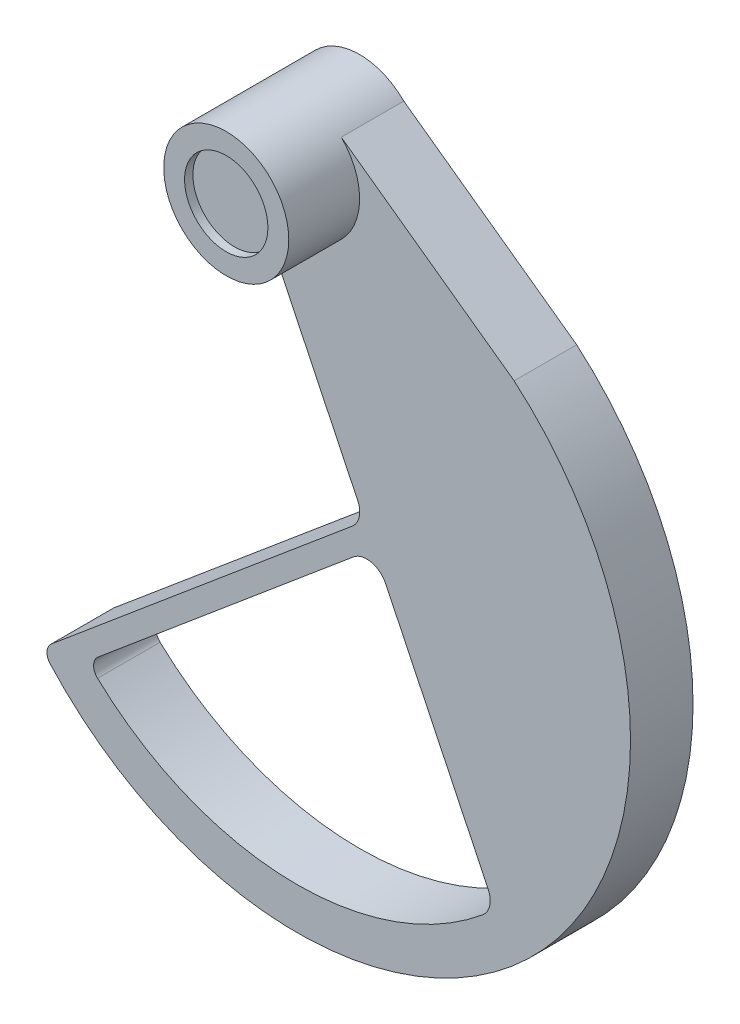
ISO-10303-21;
HEADER;
FILE_DESCRIPTION(('STEP AP214'),'2;1');
FILE_NAME('part.step','',(''),(''),'','','');
FILE_SCHEMA(('AUTOMOTIVE_DESIGN { 1 0 10303 214 1 1 1 1 }'));
ENDSEC;
DATA;
#1=APPLICATION_CONTEXT('core data for automotive mechanical design processes');
#2=APPLICATION_PROTOCOL_DEFINITION('international standard','automotive_design',2000,#1);
#3=PRODUCT_CONTEXT('',#1,'mechanical');
#4=PRODUCT('Part','Part','',(#3));
#5=PRODUCT_RELATED_PRODUCT_CATEGORY('part','',(#4));
#6=PRODUCT_DEFINITION_FORMATION('','',#4);
#7=PRODUCT_DEFINITION_CONTEXT('part definition',#1,'design');
#8=PRODUCT_DEFINITION('design','',#6,#7);
#9=PRODUCT_DEFINITION_SHAPE('','',#8);
#10=(LENGTH_UNIT() NAMED_UNIT(*) SI_UNIT(.MILLI.,.METRE.));
#11=(NAMED_UNIT(*) PLANE_ANGLE_UNIT() SI_UNIT($,.RADIAN.));
#12=(NAMED_UNIT(*) SI_UNIT($,.STERADIAN.) SOLID_ANGLE_UNIT());
#13=UNCERTAINTY_MEASURE_WITH_UNIT(LENGTH_MEASURE(1.E-05),#10,'distance_accuracy_value','');
#14=(GEOMETRIC_REPRESENTATION_CONTEXT(3) GLOBAL_UNCERTAINTY_ASSIGNED_CONTEXT((#13)) GLOBAL_UNIT_ASSIGNED_CONTEXT((#10,
#11,#12)) REPRESENTATION_CONTEXT('',''));
#15=CARTESIAN_POINT('',(0.,0.,0.));
#16=DIRECTION('',(0.,0.,1.));
#17=DIRECTION('',(1.,0.,0.));
#18=AXIS2_PLACEMENT_3D('',#15,#16,#17);
#19=CARTESIAN_POINT('',(-12.7570586950624,-6.1348621133076,15.));
#20=DIRECTION('',(0.901206602628173,0.433389731511241,0.));
#21=DIRECTION('',(-0.433389731511241,0.901206602628173,0.));
#22=AXIS2_PLACEMENT_3D('',#19,#20,#21);
#23=PLANE('',#22);
#24=DIRECTION('',(0.433389731511241,-0.901206602628173,0.));
#25=VECTOR('',#24,1.);
#26=CARTESIAN_POINT('',(-12.7570586950624,-6.1348621133076,0.));
#27=LINE('',#26,#25);
#28=CARTESIAN_POINT('',(21.2324006956412,-76.8137984043253,0.));
#29=VERTEX_POINT('',#28);
#30=CARTESIAN_POINT('',(45.844843506453,-127.9938203457,0.));
#31=VERTEX_POINT('',#30);
#32=EDGE_CURVE('E185',#29,#31,#27,.T.);
#33=ORIENTED_EDGE('',*,*,#32,.T.);
#34=DIRECTION('',(0.,0.,-1.));
#35=VECTOR('',#34,1.);
#36=CARTESIAN_POINT('',(45.844843506453,-127.9938203457,15.));
#37=LINE('',#36,#35);
#38=CARTESIAN_POINT('',(45.844843506453,-127.9938203457,15.));
#39=VERTEX_POINT('',#38);
#40=EDGE_CURVE('E45',#39,#31,#37,.T.);
#41=ORIENTED_EDGE('',*,*,#40,.F.);
#42=DIRECTION('',(0.433389731511241,-0.901206602628173,0.));
#43=VECTOR('',#42,1.);
#44=CARTESIAN_POINT('',(-12.7570586950624,-6.1348621133076,15.));
#45=LINE('',#44,#43);
#46=CARTESIAN_POINT('',(21.2324006956412,-76.8137984043253,15.));
#47=VERTEX_POINT('',#46);
#48=EDGE_CURVE('E228',#47,#39,#45,.T.);
#49=ORIENTED_EDGE('',*,*,#48,.F.);
#50=DIRECTION('',(0.,0.,-1.));
#51=VECTOR('',#50,1.);
#52=CARTESIAN_POINT('',(21.2324006956412,-76.8137984043253,15.));
#53=LINE('',#52,#51);
#54=EDGE_CURVE('E198',#47,#29,#53,.T.);
#55=ORIENTED_EDGE('',*,*,#54,.T.);
#56=EDGE_LOOP('',(#33,#41,#49,#55));
#57=FACE_BOUND('',#56,.T.);
#58=ADVANCED_FACE('F35',(#57),#23,.F.);
#59=CARTESIAN_POINT('',(41.3388104933121,-130.160769003256,15.));
#60=DIRECTION('',(0.,0.,-1.));
#61=DIRECTION('',(-1.,0.,0.));
#62=AXIS2_PLACEMENT_3D('',#59,#60,#61);
#63=CYLINDRICAL_SURFACE('',#62,4.99999999999999);
#64=CARTESIAN_POINT('',(41.3388104933121,-130.160769003256,0.));
#65=DIRECTION('',(0.,0.,1.));
#66=DIRECTION('',(1.,0.,0.));
#67=AXIS2_PLACEMENT_3D('',#64,#65,#66);
#68=CIRCLE('',#67,4.99999999999999);
#69=CARTESIAN_POINT('',(44.5187189927976,-134.019289695814,0.));
#70=VERTEX_POINT('',#69);
#71=EDGE_CURVE('E188',#31,#70,#68,.F.);
#72=ORIENTED_EDGE('',*,*,#71,.T.);
#73=DIRECTION('',(0.,0.,-1.));
#74=VECTOR('',#73,1.);
#75=CARTESIAN_POINT('',(44.5187189927976,-134.019289695814,15.));
#76=LINE('',#75,#74);
#77=CARTESIAN_POINT('',(44.5187189927976,-134.019289695814,15.));
#78=VERTEX_POINT('',#77);
#79=EDGE_CURVE('E202',#78,#70,#76,.T.);
#80=ORIENTED_EDGE('',*,*,#79,.F.);
#81=CARTESIAN_POINT('',(41.3388104933121,-130.160769003256,15.));
#82=DIRECTION('',(0.,0.,1.));
#83=DIRECTION('',(1.,0.,0.));
#84=AXIS2_PLACEMENT_3D('',#81,#82,#83);
#85=CIRCLE('',#84,4.99999999999999);
#86=EDGE_CURVE('E232',#39,#78,#85,.F.);
#87=ORIENTED_EDGE('',*,*,#86,.F.);
#88=ORIENTED_EDGE('',*,*,#40,.T.);
#89=EDGE_LOOP('',(#72,#80,#87,#88));
#90=FACE_BOUND('',#89,.T.);
#91=ADVANCED_FACE('F274',(#90),#63,.F.);
#92=CARTESIAN_POINT('',(0.,-80.,15.));
#93=DIRECTION('',(0.,0.,-1.));
#94=DIRECTION('',(-1.,0.,0.));
#95=AXIS2_PLACEMENT_3D('',#92,#93,#94);
#96=CYLINDRICAL_SURFACE('',#95,70.);
#97=CARTESIAN_POINT('',(0.,-80.,0.));
#98=DIRECTION('',(0.,0.,1.));
#99=DIRECTION('',(1.,0.,0.));
#100=AXIS2_PLACEMENT_3D('',#97,#98,#99);
#101=CIRCLE('',#100,70.);
#102=CARTESIAN_POINT('',(-47.870174388264,-131.072951785042,0.));
#103=VERTEX_POINT('',#102);
#104=EDGE_CURVE('E191',#103,#70,#101,.T.);
#105=ORIENTED_EDGE('',*,*,#104,.F.);
#106=DIRECTION('',(0.,0.,-1.));
#107=VECTOR('',#106,1.);
#108=CARTESIAN_POINT('',(-47.870174388264,-131.072951785042,15.));
#109=LINE('',#108,#107);
#110=CARTESIAN_POINT('',(-47.870174388264,-131.072951785042,15.));
#111=VERTEX_POINT('',#110);
#112=EDGE_CURVE('E155',#111,#103,#109,.T.);
#113=ORIENTED_EDGE('',*,*,#112,.F.);
#114=CARTESIAN_POINT('',(0.,-80.,15.));
#115=DIRECTION('',(0.,0.,1.));
#116=DIRECTION('',(1.,0.,0.));
#117=AXIS2_PLACEMENT_3D('',#114,#115,#116);
#118=CIRCLE('',#117,70.);
#119=EDGE_CURVE('E148',#111,#78,#118,.T.);
#120=ORIENTED_EDGE('',*,*,#119,.T.);
#121=ORIENTED_EDGE('',*,*,#79,.T.);
#122=EDGE_LOOP('',(#105,#113,#120,#121));
#123=FACE_BOUND('',#122,.T.);
#124=ADVANCED_FACE('F251',(#123),#96,.F.);
#125=CARTESIAN_POINT('',(-45.8185954859101,-128.884110994254,15.));
#126=DIRECTION('',(0.,0.,-1.));
#127=DIRECTION('',(-1.,0.,0.));
#128=AXIS2_PLACEMENT_3D('',#125,#126,#127);
#129=CYLINDRICAL_SURFACE('',#128,2.99999999999979);
#130=CARTESIAN_POINT('',(-45.8185954859101,-128.884110994254,0.));
#131=DIRECTION('',(0.,0.,1.));
#132=DIRECTION('',(1.,0.,0.));
#133=AXIS2_PLACEMENT_3D('',#130,#131,#132);
#134=CIRCLE('',#133,2.99999999999979);
#135=CARTESIAN_POINT('',(-47.7476784165524,-126.586582094174,0.));
#136=VERTEX_POINT('',#135);
#137=EDGE_CURVE('E154',#103,#136,#134,.F.);
#138=ORIENTED_EDGE('',*,*,#137,.T.);
#139=DIRECTION('',(0.,0.,-1.));
#140=VECTOR('',#139,1.);
#141=CARTESIAN_POINT('',(-47.7476784165524,-126.586582094174,15.));
#142=LINE('',#141,#140);
#143=CARTESIAN_POINT('',(-47.7476784165524,-126.586582094174,15.));
#144=VERTEX_POINT('',#143);
#145=EDGE_CURVE('E151',#144,#136,#142,.T.);
#146=ORIENTED_EDGE('',*,*,#145,.F.);
#147=CARTESIAN_POINT('',(-45.8185954859101,-128.884110994254,15.));
#148=DIRECTION('',(0.,0.,1.));
#149=DIRECTION('',(1.,0.,0.));
#150=AXIS2_PLACEMENT_3D('',#147,#148,#149);
#151=CIRCLE('',#150,2.99999999999979);
#152=EDGE_CURVE('E142',#111,#144,#151,.F.);
#153=ORIENTED_EDGE('',*,*,#152,.F.);
#154=ORIENTED_EDGE('',*,*,#112,.T.);
#155=EDGE_LOOP('',(#138,#146,#153,#154));
#156=FACE_BOUND('',#155,.T.);
#157=ADVANCED_FACE('F152',(#156),#129,.F.);
#158=CARTESIAN_POINT('',(42.5956727933285,-50.7312504333006,15.));
#159=DIRECTION('',(-0.643027643547508,0.765842966693394,0.));
#160=DIRECTION('',(-0.765842966693394,-0.643027643547508,0.));
#161=AXIS2_PLACEMENT_3D('',#158,#159,#160);
#162=PLANE('',#161);
#163=DIRECTION('',(0.765842966693394,0.643027643547508,0.));
#164=VECTOR('',#163,1.);
#165=CARTESIAN_POINT('',(42.5956727933285,-50.7312504333006,0.));
#166=LINE('',#165,#164);
#167=CARTESIAN_POINT('',(13.5112294647628,-75.1515322284145,0.));
#168=VERTEX_POINT('',#167);
#169=EDGE_CURVE('E99',#136,#168,#166,.T.);
#170=ORIENTED_EDGE('',*,*,#169,.T.);
#171=DIRECTION('',(0.,0.,-1.));
#172=VECTOR('',#171,1.);
#173=CARTESIAN_POINT('',(13.5112294647628,-75.1515322284145,15.));
#174=LINE('',#173,#172);
#175=CARTESIAN_POINT('',(13.5112294647628,-75.1515322284145,15.));
#176=VERTEX_POINT('',#175);
#177=EDGE_CURVE('E156',#176,#168,#174,.T.);
#178=ORIENTED_EDGE('',*,*,#177,.F.);
#179=DIRECTION('',(0.765842966693394,0.643027643547508,0.));
#180=VECTOR('',#179,1.);
#181=CARTESIAN_POINT('',(42.5956727933285,-50.7312504333006,15.));
#182=LINE('',#181,#180);
#183=EDGE_CURVE('E146',#144,#176,#182,.T.);
#184=ORIENTED_EDGE('',*,*,#183,.F.);
#185=ORIENTED_EDGE('',*,*,#145,.T.);
#186=EDGE_LOOP('',(#170,#178,#184,#185));
#187=FACE_BOUND('',#186,.T.);
#188=ADVANCED_FACE('F158',(#187),#162,.F.);
#189=CARTESIAN_POINT('',(10.0302471408598,-65.0565868768263,15.));
#190=DIRECTION('',(0.,0.,-1.));
#191=DIRECTION('',(-1.,0.,0.));
#192=AXIS2_PLACEMENT_3D('',#189,#190,#191);
#193=CYLINDRICAL_SURFACE('',#192,5.);
#194=CARTESIAN_POINT('',(10.0302471408598,-65.0565868768263,0.));
#195=DIRECTION('',(0.,0.,1.));
#196=DIRECTION('',(1.,0.,0.));
#197=AXIS2_PLACEMENT_3D('',#194,#195,#196);
#198=CIRCLE('',#197,5.);
#199=CARTESIAN_POINT('',(13.2441851892925,-68.8868090924212,0.));
#200=VERTEX_POINT('',#199);
#201=CARTESIAN_POINT('',(14.5362801540007,-62.8896382192701,0.));
#202=VERTEX_POINT('',#201);
#203=EDGE_CURVE('E164',#200,#202,#198,.T.);
#204=ORIENTED_EDGE('',*,*,#203,.F.);
#205=DIRECTION('',(0.,0.,-1.));
#206=VECTOR('',#205,1.);
#207=CARTESIAN_POINT('',(13.2441851892925,-68.8868090924212,15.));
#208=LINE('',#207,#206);
#209=CARTESIAN_POINT('',(13.2441851892925,-68.8868090924212,15.));
#210=VERTEX_POINT('',#209);
#211=EDGE_CURVE('E113',#210,#200,#208,.T.);
#212=ORIENTED_EDGE('',*,*,#211,.F.);
#213=CARTESIAN_POINT('',(10.0302471408598,-65.0565868768263,15.));
#214=DIRECTION('',(0.,0.,1.));
#215=DIRECTION('',(1.,0.,0.));
#216=AXIS2_PLACEMENT_3D('',#213,#214,#215);
#217=CIRCLE('',#216,5.);
#218=CARTESIAN_POINT('',(14.5362801540007,-62.8896382192701,15.));
#219=VERTEX_POINT('',#218);
#220=EDGE_CURVE('E197',#210,#219,#217,.T.);
#221=ORIENTED_EDGE('',*,*,#220,.T.);
#222=DIRECTION('',(0.,0.,-1.));
#223=VECTOR('',#222,1.);
#224=CARTESIAN_POINT('',(14.5362801540007,-62.8896382192701,15.));
#225=LINE('',#224,#223);
#226=EDGE_CURVE('E160',#219,#202,#225,.T.);
#227=ORIENTED_EDGE('',*,*,#226,.T.);
#228=EDGE_LOOP('',(#204,#212,#221,#227));
#229=FACE_BOUND('',#228,.T.);
#230=ADVANCED_FACE('F37',(#229),#193,.F.);
#231=CARTESIAN_POINT('',(39.3923101204882,-46.9459271066778,15.));
#232=DIRECTION('',(-0.642787609686534,0.766044443118983,0.));
#233=DIRECTION('',(-0.766044443118982,-0.642787609686534,0.));
#234=AXIS2_PLACEMENT_3D('',#231,#232,#233);
#235=PLANE('',#234);
#236=DIRECTION('',(0.766044443118982,0.642787609686534,0.));
#237=VECTOR('',#236,1.);
#238=CARTESIAN_POINT('',(39.3923101204882,-46.9459271066778,0.));
#239=LINE('',#238,#237);
#240=CARTESIAN_POINT('',(-58.9406362868111,-129.457066169617,0.));
#241=VERTEX_POINT('',#240);
#242=EDGE_CURVE('E167',#241,#200,#239,.T.);
#243=ORIENTED_EDGE('',*,*,#242,.F.);
#244=DIRECTION('',(0.,0.,-1.));
#245=VECTOR('',#244,1.);
#246=CARTESIAN_POINT('',(-58.9406362868111,-129.457066169617,15.));
#247=LINE('',#246,#245);
#248=CARTESIAN_POINT('',(-58.9406362868111,-129.457066169617,15.));
#249=VERTEX_POINT('',#248);
#250=EDGE_CURVE('E213',#249,#241,#247,.T.);
#251=ORIENTED_EDGE('',*,*,#250,.F.);
#252=DIRECTION('',(0.766044443118982,0.642787609686534,0.));
#253=VECTOR('',#252,1.);
#254=CARTESIAN_POINT('',(39.3923101204882,-46.9459271066778,15.));
#255=LINE('',#254,#253);
#256=EDGE_CURVE('E245',#249,#210,#255,.T.);
#257=ORIENTED_EDGE('',*,*,#256,.T.);
#258=ORIENTED_EDGE('',*,*,#211,.T.);
#259=EDGE_LOOP('',(#243,#251,#257,#258));
#260=FACE_BOUND('',#259,.T.);
#261=ADVANCED_FACE('F295',(#260),#235,.T.);
#262=CARTESIAN_POINT('',(-57.0122734577518,-131.755199498973,15.));
#263=DIRECTION('',(0.,0.,-1.));
#264=DIRECTION('',(-1.,0.,0.));
#265=AXIS2_PLACEMENT_3D('',#262,#263,#264);
#266=CYLINDRICAL_SURFACE('',#265,2.99999999999976);
#267=CARTESIAN_POINT('',(-57.0122734577518,-131.755199498973,0.));
#268=DIRECTION('',(0.,0.,1.));
#269=DIRECTION('',(1.,0.,0.));
#270=AXIS2_PLACEMENT_3D('',#267,#268,#269);
#271=CIRCLE('',#270,2.99999999999976);
#272=CARTESIAN_POINT('',(-59.2335308651964,-133.771635843089,0.));
#273=VERTEX_POINT('',#272);
#274=EDGE_CURVE('E171',#273,#241,#271,.F.);
#275=ORIENTED_EDGE('',*,*,#274,.F.);
#276=DIRECTION('',(0.,0.,-1.));
#277=VECTOR('',#276,1.);
#278=CARTESIAN_POINT('',(-59.2335308651964,-133.771635843089,15.));
#279=LINE('',#278,#277);
#280=CARTESIAN_POINT('',(-59.2335308651964,-133.771635843089,15.));
#281=VERTEX_POINT('',#280);
#282=EDGE_CURVE('E210',#281,#273,#279,.T.);
#283=ORIENTED_EDGE('',*,*,#282,.F.);
#284=CARTESIAN_POINT('',(-57.0122734577518,-131.755199498973,15.));
#285=DIRECTION('',(0.,0.,1.));
#286=DIRECTION('',(1.,0.,0.));
#287=AXIS2_PLACEMENT_3D('',#284,#285,#286);
#288=CIRCLE('',#287,2.99999999999976);
#289=EDGE_CURVE('E239',#281,#249,#288,.F.);
#290=ORIENTED_EDGE('',*,*,#289,.T.);
#291=ORIENTED_EDGE('',*,*,#250,.T.);
#292=EDGE_LOOP('',(#275,#283,#290,#291));
#293=FACE_BOUND('',#292,.T.);
#294=ADVANCED_FACE('F292',(#293),#266,.T.);
#295=CARTESIAN_POINT('',(0.,-80.,15.));
#296=DIRECTION('',(0.,0.,-1.));
#297=DIRECTION('',(-1.,0.,0.));
#298=AXIS2_PLACEMENT_3D('',#295,#296,#297);
#299=CYLINDRICAL_SURFACE('',#298,80.);
#300=CARTESIAN_POINT('',(0.,-80.,0.));
#301=DIRECTION('',(0.,0.,1.));
#302=DIRECTION('',(1.,0.,0.));
#303=AXIS2_PLACEMENT_3D('',#300,#301,#302);
#304=CIRCLE('',#303,80.);
#305=CARTESIAN_POINT('',(52.0761789176771,-19.2705047828151,0.));
#306=VERTEX_POINT('',#305);
#307=EDGE_CURVE('E174',#273,#306,#304,.T.);
#308=ORIENTED_EDGE('',*,*,#307,.T.);
#309=DIRECTION('',(0.,0.,-1.));
#310=VECTOR('',#309,1.);
#311=CARTESIAN_POINT('',(52.0761789176771,-19.2705047828151,15.));
#312=LINE('',#311,#310);
#313=CARTESIAN_POINT('',(52.0761789176771,-19.2705047828151,15.));
#314=VERTEX_POINT('',#313);
#315=EDGE_CURVE('E208',#314,#306,#312,.T.);
#316=ORIENTED_EDGE('',*,*,#315,.F.);
#317=CARTESIAN_POINT('',(0.,-80.,15.));
#318=DIRECTION('',(0.,0.,1.));
#319=DIRECTION('',(1.,0.,0.));
#320=AXIS2_PLACEMENT_3D('',#317,#318,#319);
#321=CIRCLE('',#320,80.);
#322=EDGE_CURVE('E235',#281,#314,#321,.T.);
#323=ORIENTED_EDGE('',*,*,#322,.F.);
#324=ORIENTED_EDGE('',*,*,#282,.T.);
#325=EDGE_LOOP('',(#308,#316,#323,#324));
#326=FACE_BOUND('',#325,.T.);
#327=ADVANCED_FACE('F289',(#326),#299,.T.);
#328=CARTESIAN_POINT('',(8.65474635415258,12.0128323695447,15.));
#329=DIRECTION('',(0.584549661802916,0.811357931424902,0.));
#330=DIRECTION('',(-0.811357931424902,0.584549661802916,0.));
#331=AXIS2_PLACEMENT_3D('',#328,#329,#330);
#332=PLANE('',#331);
#333=DIRECTION('',(0.811357931424902,-0.584549661802916,0.));
#334=VECTOR('',#333,1.);
#335=CARTESIAN_POINT('',(8.65474635415258,12.0128323695447,0.));
#336=LINE('',#335,#334);
#337=CARTESIAN_POINT('',(10.6066017177981,10.6066017177983,0.));
#338=VERTEX_POINT('',#337);
#339=EDGE_CURVE('E177',#338,#306,#336,.T.);
#340=ORIENTED_EDGE('',*,*,#339,.F.);
#341=DIRECTION('',(0.,0.,-1.));
#342=VECTOR('',#341,1.);
#343=CARTESIAN_POINT('',(10.6066017177981,10.6066017177983,15.));
#344=LINE('',#343,#342);
#345=CARTESIAN_POINT('',(10.6066017177981,10.6066017177983,15.));
#346=VERTEX_POINT('',#345);
#347=EDGE_CURVE('E211',#346,#338,#344,.T.);
#348=ORIENTED_EDGE('',*,*,#347,.F.);
#349=DIRECTION('',(0.811357931424902,-0.584549661802916,0.));
#350=VECTOR('',#349,1.);
#351=CARTESIAN_POINT('',(8.65474635415258,12.0128323695447,15.));
#352=LINE('',#351,#350);
#353=EDGE_CURVE('E218',#346,#314,#352,.T.);
#354=ORIENTED_EDGE('',*,*,#353,.T.);
#355=ORIENTED_EDGE('',*,*,#315,.T.);
#356=EDGE_LOOP('',(#340,#348,#354,#355));
#357=FACE_BOUND('',#356,.T.);
#358=ADVANCED_FACE('F285',(#357),#332,.T.);
#359=CARTESIAN_POINT('',(0.,0.,15.));
#360=DIRECTION('',(0.,0.,-1.));
#361=DIRECTION('',(-1.,0.,0.));
#362=AXIS2_PLACEMENT_3D('',#359,#360,#361);
#363=CYLINDRICAL_SURFACE('',#362,15.);
#364=CARTESIAN_POINT('',(0.,0.,0.));
#365=DIRECTION('',(0.,0.,1.));
#366=DIRECTION('',(1.,0.,0.));
#367=AXIS2_PLACEMENT_3D('',#364,#365,#366);
#368=CIRCLE('',#367,15.);
#369=CARTESIAN_POINT('',(-10.6066017177981,-10.6066017177983,0.));
#370=VERTEX_POINT('',#369);
#371=EDGE_CURVE('E180',#338,#370,#368,.T.);
#372=ORIENTED_EDGE('',*,*,#371,.T.);
#373=DIRECTION('',(0.,0.,-1.));
#374=VECTOR('',#373,1.);
#375=CARTESIAN_POINT('',(-10.6066017177981,-10.6066017177983,15.));
#376=LINE('',#375,#374);
#377=CARTESIAN_POINT('',(-10.6066017177981,-10.6066017177983,15.));
#378=VERTEX_POINT('',#377);
#379=EDGE_CURVE('E207',#378,#370,#376,.T.);
#380=ORIENTED_EDGE('',*,*,#379,.F.);
#381=CARTESIAN_POINT('',(0.,0.,15.));
#382=DIRECTION('',(0.,0.,1.));
#383=DIRECTION('',(1.,0.,0.));
#384=AXIS2_PLACEMENT_3D('',#381,#382,#383);
#385=CIRCLE('',#384,15.);
#386=EDGE_CURVE('E11',#378,#346,#385,.T.);
#387=ORIENTED_EDGE('',*,*,#386,.T.);
#388=ORIENTED_EDGE('',*,*,#347,.T.);
#389=EDGE_LOOP('',(#372,#380,#387,#388));
#390=FACE_BOUND('',#389,.T.);
#391=CARTESIAN_POINT('',(0.,0.,32.));
#392=DIRECTION('',(0.,0.,1.));
#393=DIRECTION('',(1.,0.,0.));
#394=AXIS2_PLACEMENT_3D('',#391,#392,#393);
#395=CIRCLE('',#394,15.);
#396=CARTESIAN_POINT('',(15.,0.,32.));
#397=VERTEX_POINT('',#396);
#398=EDGE_CURVE('E168',#397,#397,#395,.T.);
#399=ORIENTED_EDGE('',*,*,#398,.F.);
#400=EDGE_LOOP('',(#399));
#401=FACE_BOUND('',#400,.T.);
#402=ADVANCED_FACE('F268',(#390,#401),#363,.T.);
#403=CARTESIAN_POINT('',(-12.7570586950624,-6.13486211330761,15.));
#404=DIRECTION('',(0.901206602628173,0.433389731511242,0.));
#405=DIRECTION('',(-0.433389731511242,0.901206602628173,0.));
#406=AXIS2_PLACEMENT_3D('',#403,#404,#405);
#407=PLANE('',#406);
#408=DIRECTION('',(0.433389731511242,-0.901206602628173,0.));
#409=VECTOR('',#408,1.);
#410=CARTESIAN_POINT('',(-12.7570586950624,-6.13486211330761,0.));
#411=LINE('',#410,#409);
#412=EDGE_CURVE('E182',#370,#202,#411,.T.);
#413=ORIENTED_EDGE('',*,*,#412,.T.);
#414=ORIENTED_EDGE('',*,*,#226,.F.);
#415=DIRECTION('',(0.433389731511242,-0.901206602628173,0.));
#416=VECTOR('',#415,1.);
#417=CARTESIAN_POINT('',(-12.7570586950624,-6.13486211330761,15.));
#418=LINE('',#417,#416);
#419=EDGE_CURVE('E227',#378,#219,#418,.T.);
#420=ORIENTED_EDGE('',*,*,#419,.F.);
#421=ORIENTED_EDGE('',*,*,#379,.T.);
#422=EDGE_LOOP('',(#413,#414,#420,#421));
#423=FACE_BOUND('',#422,.T.);
#424=ADVANCED_FACE('F261',(#423),#407,.F.);
#425=CARTESIAN_POINT('',(16.7263676825004,-78.9807470618814,15.));
#426=DIRECTION('',(0.,0.,-1.));
#427=DIRECTION('',(-1.,0.,0.));
#428=AXIS2_PLACEMENT_3D('',#425,#426,#427);
#429=CYLINDRICAL_SURFACE('',#428,5.);
#430=CARTESIAN_POINT('',(16.7263676825004,-78.9807470618814,0.));
#431=DIRECTION('',(0.,0.,1.));
#432=DIRECTION('',(1.,0.,0.));
#433=AXIS2_PLACEMENT_3D('',#430,#431,#432);
#434=CIRCLE('',#433,5.);
#435=EDGE_CURVE('E105',#168,#29,#434,.F.);
#436=ORIENTED_EDGE('',*,*,#435,.T.);
#437=ORIENTED_EDGE('',*,*,#54,.F.);
#438=CARTESIAN_POINT('',(16.7263676825004,-78.9807470618814,15.));
#439=DIRECTION('',(0.,0.,1.));
#440=DIRECTION('',(1.,0.,0.));
#441=AXIS2_PLACEMENT_3D('',#438,#439,#440);
#442=CIRCLE('',#441,5.);
#443=EDGE_CURVE('E54',#176,#47,#442,.F.);
#444=ORIENTED_EDGE('',*,*,#443,.F.);
#445=ORIENTED_EDGE('',*,*,#177,.T.);
#446=EDGE_LOOP('',(#436,#437,#444,#445));
#447=FACE_BOUND('',#446,.T.);
#448=ADVANCED_FACE('F259',(#447),#429,.F.);
#449=CARTESIAN_POINT('',(0.,0.,15.));
#450=DIRECTION('',(0.,0.,1.));
#451=DIRECTION('',(1.,0.,0.));
#452=AXIS2_PLACEMENT_3D('',#449,#450,#451);
#453=PLANE('',#452);
#454=ORIENTED_EDGE('',*,*,#386,.F.);
#455=ORIENTED_EDGE('',*,*,#419,.T.);
#456=ORIENTED_EDGE('',*,*,#220,.F.);
#457=ORIENTED_EDGE('',*,*,#256,.F.);
#458=ORIENTED_EDGE('',*,*,#289,.F.);
#459=ORIENTED_EDGE('',*,*,#322,.T.);
#460=ORIENTED_EDGE('',*,*,#353,.F.);
#461=EDGE_LOOP('',(#454,#455,#456,#457,#458,#459,#460));
#462=FACE_BOUND('',#461,.T.);
#463=ORIENTED_EDGE('',*,*,#48,.T.);
#464=ORIENTED_EDGE('',*,*,#86,.T.);
#465=ORIENTED_EDGE('',*,*,#119,.F.);
#466=ORIENTED_EDGE('',*,*,#152,.T.);
#467=ORIENTED_EDGE('',*,*,#183,.T.);
#468=ORIENTED_EDGE('',*,*,#443,.T.);
#469=EDGE_LOOP('',(#463,#464,#465,#466,#467,#468));
#470=FACE_BOUND('',#469,.T.);
#471=ADVANCED_FACE('F144',(#462,#470),#453,.T.);
#472=CARTESIAN_POINT('',(0.,0.,0.));
#473=DIRECTION('',(0.,0.,1.));
#474=DIRECTION('',(1.,0.,0.));
#475=AXIS2_PLACEMENT_3D('',#472,#473,#474);
#476=PLANE('',#475);
#477=ORIENTED_EDGE('',*,*,#203,.T.);
#478=ORIENTED_EDGE('',*,*,#412,.F.);
#479=ORIENTED_EDGE('',*,*,#371,.F.);
#480=ORIENTED_EDGE('',*,*,#339,.T.);
#481=ORIENTED_EDGE('',*,*,#307,.F.);
#482=ORIENTED_EDGE('',*,*,#274,.T.);
#483=ORIENTED_EDGE('',*,*,#242,.T.);
#484=EDGE_LOOP('',(#477,#478,#479,#480,#481,#482,#483));
#485=FACE_BOUND('',#484,.T.);
#486=ORIENTED_EDGE('',*,*,#32,.F.);
#487=ORIENTED_EDGE('',*,*,#435,.F.);
#488=ORIENTED_EDGE('',*,*,#169,.F.);
#489=ORIENTED_EDGE('',*,*,#137,.F.);
#490=ORIENTED_EDGE('',*,*,#104,.T.);
#491=ORIENTED_EDGE('',*,*,#71,.F.);
#492=EDGE_LOOP('',(#486,#487,#488,#489,#490,#491));
#493=FACE_BOUND('',#492,.T.);
#494=ADVANCED_FACE('F255',(#485,#493),#476,.F.);
#495=CARTESIAN_POINT('',(0.,0.,32.));
#496=DIRECTION('',(0.,0.,1.));
#497=DIRECTION('',(1.,0.,0.));
#498=AXIS2_PLACEMENT_3D('',#495,#496,#497);
#499=PLANE('',#498);
#500=CARTESIAN_POINT('',(0.,0.,32.));
#501=DIRECTION('',(0.,0.,1.));
#502=DIRECTION('',(1.,0.,0.));
#503=AXIS2_PLACEMENT_3D('',#500,#501,#502);
#504=CIRCLE('',#503,10.);
#505=CARTESIAN_POINT('',(10.,0.,32.));
#506=VERTEX_POINT('',#505);
#507=EDGE_CURVE('E313',#506,#506,#504,.T.);
#508=ORIENTED_EDGE('',*,*,#507,.F.);
#509=EDGE_LOOP('',(#508));
#510=FACE_BOUND('',#509,.T.);
#511=ORIENTED_EDGE('',*,*,#398,.T.);
#512=EDGE_LOOP('',(#511));
#513=FACE_BOUND('',#512,.T.);
#514=ADVANCED_FACE('F324',(#510,#513),#499,.T.);
#515=CARTESIAN_POINT('',(0.,0.,30.));
#516=DIRECTION('',(0.,0.,1.));
#517=DIRECTION('',(1.,0.,0.));
#518=AXIS2_PLACEMENT_3D('',#515,#516,#517);
#519=CYLINDRICAL_SURFACE('',#518,10.);
#520=CARTESIAN_POINT('',(0.,0.,30.));
#521=DIRECTION('',(0.,0.,1.));
#522=DIRECTION('',(1.,0.,0.));
#523=AXIS2_PLACEMENT_3D('',#520,#521,#522);
#524=CIRCLE('',#523,10.);
#525=CARTESIAN_POINT('',(10.,0.,30.));
#526=VERTEX_POINT('',#525);
#527=EDGE_CURVE('E312',#526,#526,#524,.T.);
#528=ORIENTED_EDGE('',*,*,#527,.F.);
#529=EDGE_LOOP('',(#528));
#530=FACE_BOUND('',#529,.T.);
#531=ORIENTED_EDGE('',*,*,#507,.T.);
#532=EDGE_LOOP('',(#531));
#533=FACE_BOUND('',#532,.T.);
#534=ADVANCED_FACE('F321',(#530,#533),#519,.F.);
#535=CARTESIAN_POINT('',(0.,0.,30.));
#536=DIRECTION('',(0.,0.,1.));
#537=DIRECTION('',(1.,0.,0.));
#538=AXIS2_PLACEMENT_3D('',#535,#536,#537);
#539=PLANE('',#538);
#540=ORIENTED_EDGE('',*,*,#527,.T.);
#541=EDGE_LOOP('',(#540));
#542=FACE_BOUND('',#541,.T.);
#543=ADVANCED_FACE('F319',(#542),#539,.T.);
#544=CLOSED_SHELL('',(#58,#91,#124,#157,#188,#230,#261,#294,#327,#358,#402,#424,#448,#471,#494,
#514,#534,#543));
#545=MANIFOLD_SOLID_BREP('B2',#544);
#546=ADVANCED_BREP_SHAPE_REPRESENTATION('',(#18,#545),#14);
#547=SHAPE_DEFINITION_REPRESENTATION(#9,#546);
ENDSEC;
END-ISO-10303-21;
